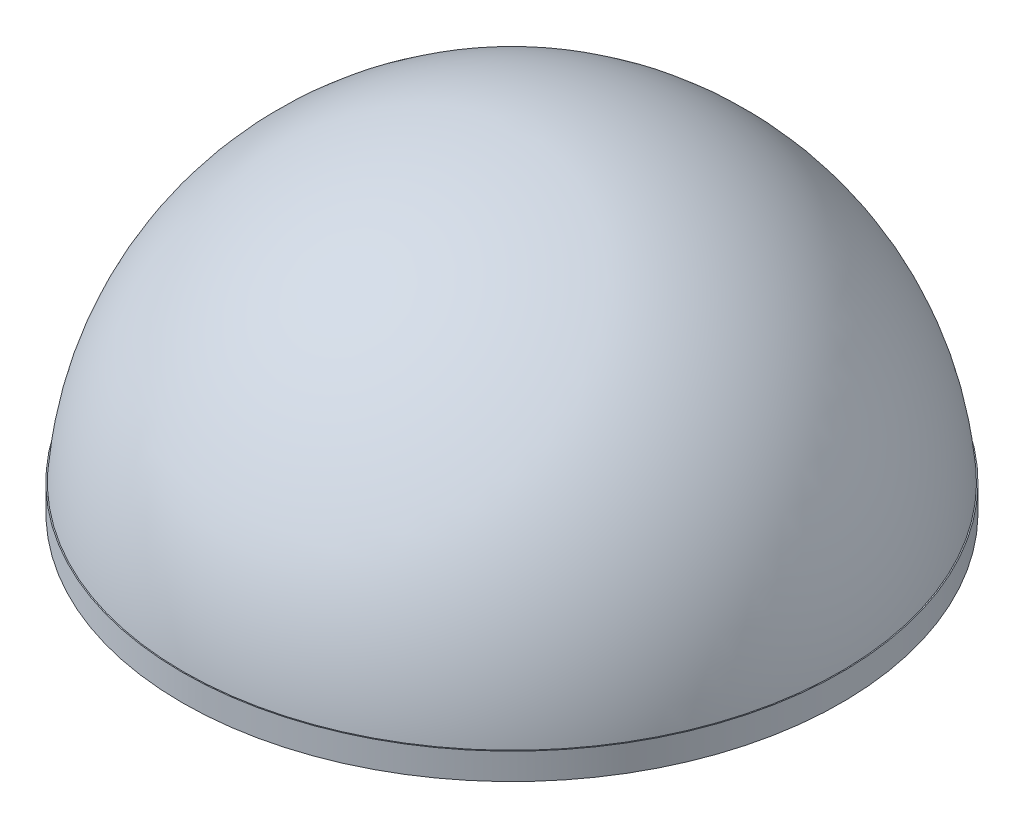
ISO-10303-21;
HEADER;
FILE_DESCRIPTION(('STEP AP214'),'2;1');
FILE_NAME('part.step','',(''),(''),'','','');
FILE_SCHEMA(('AUTOMOTIVE_DESIGN { 1 0 10303 214 1 1 1 1 }'));
ENDSEC;
DATA;
#1=APPLICATION_CONTEXT('core data for automotive mechanical design processes');
#2=APPLICATION_PROTOCOL_DEFINITION('international standard','automotive_design',2000,#1);
#3=PRODUCT_CONTEXT('',#1,'mechanical');
#4=PRODUCT('Part','Part','',(#3));
#5=PRODUCT_RELATED_PRODUCT_CATEGORY('part','',(#4));
#6=PRODUCT_DEFINITION_FORMATION('','',#4);
#7=PRODUCT_DEFINITION_CONTEXT('part definition',#1,'design');
#8=PRODUCT_DEFINITION('design','',#6,#7);
#9=PRODUCT_DEFINITION_SHAPE('','',#8);
#10=(LENGTH_UNIT() NAMED_UNIT(*) SI_UNIT(.MILLI.,.METRE.));
#11=(NAMED_UNIT(*) PLANE_ANGLE_UNIT() SI_UNIT($,.RADIAN.));
#12=(NAMED_UNIT(*) SI_UNIT($,.STERADIAN.) SOLID_ANGLE_UNIT());
#13=UNCERTAINTY_MEASURE_WITH_UNIT(LENGTH_MEASURE(1.E-05),#10,'distance_accuracy_value','');
#14=(GEOMETRIC_REPRESENTATION_CONTEXT(3) GLOBAL_UNCERTAINTY_ASSIGNED_CONTEXT((#13)) GLOBAL_UNIT_ASSIGNED_CONTEXT((#10,
#11,#12)) REPRESENTATION_CONTEXT('',''));
#15=CARTESIAN_POINT('',(0.,0.,0.));
#16=DIRECTION('',(0.,0.,1.));
#17=DIRECTION('',(1.,0.,0.));
#18=AXIS2_PLACEMENT_3D('',#15,#16,#17);
#19=CARTESIAN_POINT('',(0.,0.,0.));
#20=DIRECTION('',(0.,-1.,0.));
#21=DIRECTION('',(0.,0.,1.));
#22=AXIS2_PLACEMENT_3D('',#19,#20,#21);
#23=PLANE('',#22);
#24=CARTESIAN_POINT('',(0.,0.,0.));
#25=DIRECTION('',(0.,-1.,0.));
#26=DIRECTION('',(1.,0.,0.));
#27=AXIS2_PLACEMENT_3D('',#24,#25,#26);
#28=CIRCLE('',#27,30.48);
#29=CARTESIAN_POINT('',(30.48,2.12840702415877E-13,0.));
#30=VERTEX_POINT('',#29);
#31=EDGE_CURVE('E10',#30,#30,#28,.T.);
#32=ORIENTED_EDGE('',*,*,#31,.F.);
#33=EDGE_LOOP('',(#32));
#34=FACE_BOUND('',#33,.T.);
#35=CARTESIAN_POINT('',(0.,0.,0.));
#36=DIRECTION('',(0.,1.,0.));
#37=DIRECTION('',(0.,0.,1.));
#38=AXIS2_PLACEMENT_3D('',#35,#36,#37);
#39=CIRCLE('',#38,31.75);
#40=CARTESIAN_POINT('',(0.,0.,31.75));
#41=VERTEX_POINT('',#40);
#42=EDGE_CURVE('E45',#41,#41,#39,.T.);
#43=ORIENTED_EDGE('',*,*,#42,.F.);
#44=EDGE_LOOP('',(#43));
#45=FACE_BOUND('',#44,.T.);
#46=ADVANCED_FACE('F32',(#34,#45),#23,.T.);
#47=CARTESIAN_POINT('',(0.,0.,0.));
#48=DIRECTION('',(0.,0.,-1.));
#49=DIRECTION('',(-1.,0.,0.));
#50=AXIS2_PLACEMENT_3D('',#47,#48,#49);
#51=SPHERICAL_SURFACE('',#50,30.48);
#52=CARTESIAN_POINT('',(0.,0.,0.));
#53=DIRECTION('',(0.,-1.,0.));
#54=DIRECTION('',(1.,0.,0.));
#55=AXIS2_PLACEMENT_3D('',#52,#53,#54);
#56=SPHERICAL_SURFACE('',#55,30.48);
#57=ORIENTED_EDGE('',*,*,#31,.T.);
#58=EDGE_LOOP('',(#57));
#59=FACE_BOUND('',#58,.T.);
#60=ADVANCED_FACE('F60',(#59),#56,.F.);
#61=CARTESIAN_POINT('',(0.,2.54,0.));
#62=DIRECTION('',(0.,1.,0.));
#63=DIRECTION('',(0.,0.,1.));
#64=AXIS2_PLACEMENT_3D('',#61,#62,#63);
#65=PLANE('',#64);
#66=CARTESIAN_POINT('',(0.,2.54,0.));
#67=DIRECTION('',(0.,1.,0.));
#68=DIRECTION('',(0.,0.,1.));
#69=AXIS2_PLACEMENT_3D('',#66,#67,#68);
#70=CIRCLE('',#69,31.6482369177179);
#71=CARTESIAN_POINT('',(0.,2.54,31.6482369177179));
#72=VERTEX_POINT('',#71);
#73=EDGE_CURVE('E36',#72,#72,#70,.T.);
#74=ORIENTED_EDGE('',*,*,#73,.F.);
#75=EDGE_LOOP('',(#74));
#76=FACE_BOUND('',#75,.T.);
#77=CARTESIAN_POINT('',(0.,2.54,0.));
#78=DIRECTION('',(0.,1.,0.));
#79=DIRECTION('',(0.,0.,1.));
#80=AXIS2_PLACEMENT_3D('',#77,#78,#79);
#81=CIRCLE('',#80,31.75);
#82=CARTESIAN_POINT('',(0.,2.54,31.75));
#83=VERTEX_POINT('',#82);
#84=EDGE_CURVE('E43',#83,#83,#81,.T.);
#85=ORIENTED_EDGE('',*,*,#84,.T.);
#86=EDGE_LOOP('',(#85));
#87=FACE_BOUND('',#86,.T.);
#88=ADVANCED_FACE('F51',(#76,#87),#65,.T.);
#89=CARTESIAN_POINT('',(0.,2.54,0.));
#90=DIRECTION('',(0.,-1.,0.));
#91=DIRECTION('',(0.,0.,-1.));
#92=AXIS2_PLACEMENT_3D('',#89,#90,#91);
#93=CYLINDRICAL_SURFACE('',#92,31.75);
#94=ORIENTED_EDGE('',*,*,#84,.F.);
#95=EDGE_LOOP('',(#94));
#96=FACE_BOUND('',#95,.T.);
#97=ORIENTED_EDGE('',*,*,#42,.T.);
#98=EDGE_LOOP('',(#97));
#99=FACE_BOUND('',#98,.T.);
#100=ADVANCED_FACE('F53',(#96,#99),#93,.T.);
#101=CARTESIAN_POINT('',(0.,0.,0.));
#102=DIRECTION('',(0.,0.,-1.));
#103=DIRECTION('',(-1.,0.,0.));
#104=AXIS2_PLACEMENT_3D('',#101,#102,#103);
#105=SPHERICAL_SURFACE('',#104,31.75);
#106=CARTESIAN_POINT('',(0.,0.,0.));
#107=DIRECTION('',(0.,1.,0.));
#108=DIRECTION('',(0.,0.,1.));
#109=AXIS2_PLACEMENT_3D('',#106,#107,#108);
#110=SPHERICAL_SURFACE('',#109,31.75);
#111=ORIENTED_EDGE('',*,*,#73,.T.);
#112=EDGE_LOOP('',(#111));
#113=FACE_BOUND('',#112,.T.);
#114=ADVANCED_FACE('F34',(#113),#110,.T.);
#115=CLOSED_SHELL('',(#46,#60,#88,#100,#114));
#116=MANIFOLD_SOLID_BREP('B2',#115);
#117=ADVANCED_BREP_SHAPE_REPRESENTATION('',(#18,#116),#14);
#118=SHAPE_DEFINITION_REPRESENTATION(#9,#117);
ENDSEC;
END-ISO-10303-21;
